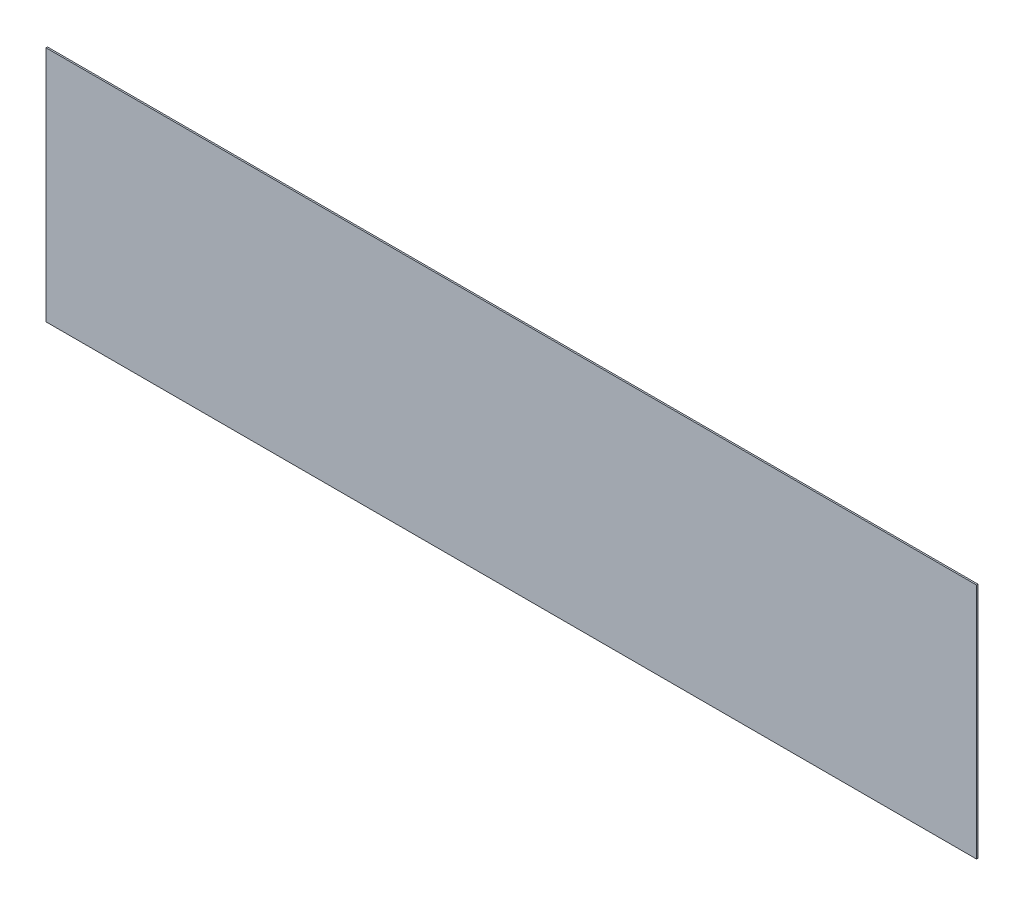
ISO-10303-21;
HEADER;
FILE_DESCRIPTION(('STEP AP214'),'2;1');
FILE_NAME('part.step','',(''),(''),'','','');
FILE_SCHEMA(('AUTOMOTIVE_DESIGN { 1 0 10303 214 1 1 1 1 }'));
ENDSEC;
DATA;
#1=APPLICATION_CONTEXT('core data for automotive mechanical design processes');
#2=APPLICATION_PROTOCOL_DEFINITION('international standard','automotive_design',2000,#1);
#3=PRODUCT_CONTEXT('',#1,'mechanical');
#4=PRODUCT('Part','Part','',(#3));
#5=PRODUCT_RELATED_PRODUCT_CATEGORY('part','',(#4));
#6=PRODUCT_DEFINITION_FORMATION('','',#4);
#7=PRODUCT_DEFINITION_CONTEXT('part definition',#1,'design');
#8=PRODUCT_DEFINITION('design','',#6,#7);
#9=PRODUCT_DEFINITION_SHAPE('','',#8);
#10=(LENGTH_UNIT() NAMED_UNIT(*) SI_UNIT(.MILLI.,.METRE.));
#11=(NAMED_UNIT(*) PLANE_ANGLE_UNIT() SI_UNIT($,.RADIAN.));
#12=(NAMED_UNIT(*) SI_UNIT($,.STERADIAN.) SOLID_ANGLE_UNIT());
#13=UNCERTAINTY_MEASURE_WITH_UNIT(LENGTH_MEASURE(1.E-05),#10,'distance_accuracy_value','');
#14=(GEOMETRIC_REPRESENTATION_CONTEXT(3) GLOBAL_UNCERTAINTY_ASSIGNED_CONTEXT((#13)) GLOBAL_UNIT_ASSIGNED_CONTEXT((#10,
#11,#12)) REPRESENTATION_CONTEXT('',''));
#15=CARTESIAN_POINT('',(0.,0.,0.));
#16=DIRECTION('',(0.,0.,1.));
#17=DIRECTION('',(1.,0.,0.));
#18=AXIS2_PLACEMENT_3D('',#15,#16,#17);
#19=CARTESIAN_POINT('',(0.,0.,0.511));
#20=DIRECTION('',(1.,0.,0.));
#21=DIRECTION('',(0.,0.,-1.));
#22=AXIS2_PLACEMENT_3D('',#19,#20,#21);
#23=PLANE('',#22);
#24=DIRECTION('',(0.,-1.,0.));
#25=VECTOR('',#24,1.);
#26=CARTESIAN_POINT('',(0.,0.,0.));
#27=LINE('',#26,#25);
#28=CARTESIAN_POINT('',(0.,82.,0.));
#29=VERTEX_POINT('',#28);
#30=CARTESIAN_POINT('',(0.,0.,0.));
#31=VERTEX_POINT('',#30);
#32=EDGE_CURVE('E95',#29,#31,#27,.T.);
#33=ORIENTED_EDGE('',*,*,#32,.T.);
#34=DIRECTION('',(0.,0.,-1.));
#35=VECTOR('',#34,1.);
#36=CARTESIAN_POINT('',(0.,0.,0.511));
#37=LINE('',#36,#35);
#38=CARTESIAN_POINT('',(0.,0.,0.511));
#39=VERTEX_POINT('',#38);
#40=EDGE_CURVE('E11',#39,#31,#37,.T.);
#41=ORIENTED_EDGE('',*,*,#40,.F.);
#42=DIRECTION('',(0.,-1.,0.));
#43=VECTOR('',#42,1.);
#44=CARTESIAN_POINT('',(0.,0.,0.511));
#45=LINE('',#44,#43);
#46=CARTESIAN_POINT('',(0.,82.,0.511));
#47=VERTEX_POINT('',#46);
#48=EDGE_CURVE('E83',#47,#39,#45,.T.);
#49=ORIENTED_EDGE('',*,*,#48,.F.);
#50=DIRECTION('',(0.,0.,-1.));
#51=VECTOR('',#50,1.);
#52=CARTESIAN_POINT('',(0.,82.,0.511));
#53=LINE('',#52,#51);
#54=EDGE_CURVE('E91',#47,#29,#53,.T.);
#55=ORIENTED_EDGE('',*,*,#54,.T.);
#56=EDGE_LOOP('',(#33,#41,#49,#55));
#57=FACE_BOUND('',#56,.T.);
#58=ADVANCED_FACE('F32',(#57),#23,.F.);
#59=CARTESIAN_POINT('',(0.,0.,0.511));
#60=DIRECTION('',(0.,1.,0.));
#61=DIRECTION('',(0.,0.,1.));
#62=AXIS2_PLACEMENT_3D('',#59,#60,#61);
#63=PLANE('',#62);
#64=DIRECTION('',(1.,0.,0.));
#65=VECTOR('',#64,1.);
#66=CARTESIAN_POINT('',(0.,0.,0.));
#67=LINE('',#66,#65);
#68=CARTESIAN_POINT('',(321.5,0.,0.));
#69=VERTEX_POINT('',#68);
#70=EDGE_CURVE('E87',#31,#69,#67,.T.);
#71=ORIENTED_EDGE('',*,*,#70,.T.);
#72=DIRECTION('',(0.,0.,-1.));
#73=VECTOR('',#72,1.);
#74=CARTESIAN_POINT('',(321.5,0.,0.511));
#75=LINE('',#74,#73);
#76=CARTESIAN_POINT('',(321.5,0.,0.511));
#77=VERTEX_POINT('',#76);
#78=EDGE_CURVE('E40',#77,#69,#75,.T.);
#79=ORIENTED_EDGE('',*,*,#78,.F.);
#80=DIRECTION('',(1.,0.,0.));
#81=VECTOR('',#80,1.);
#82=CARTESIAN_POINT('',(0.,0.,0.511));
#83=LINE('',#82,#81);
#84=EDGE_CURVE('E78',#39,#77,#83,.T.);
#85=ORIENTED_EDGE('',*,*,#84,.F.);
#86=ORIENTED_EDGE('',*,*,#40,.T.);
#87=EDGE_LOOP('',(#71,#79,#85,#86));
#88=FACE_BOUND('',#87,.T.);
#89=ADVANCED_FACE('F86',(#88),#63,.F.);
#90=CARTESIAN_POINT('',(321.5,0.,0.511));
#91=DIRECTION('',(-1.,0.,0.));
#92=DIRECTION('',(0.,0.,1.));
#93=AXIS2_PLACEMENT_3D('',#90,#91,#92);
#94=PLANE('',#93);
#95=DIRECTION('',(0.,1.,0.));
#96=VECTOR('',#95,1.);
#97=CARTESIAN_POINT('',(321.5,0.,0.));
#98=LINE('',#97,#96);
#99=CARTESIAN_POINT('',(321.5,82.,0.));
#100=VERTEX_POINT('',#99);
#101=EDGE_CURVE('E65',#69,#100,#98,.T.);
#102=ORIENTED_EDGE('',*,*,#101,.T.);
#103=DIRECTION('',(0.,0.,-1.));
#104=VECTOR('',#103,1.);
#105=CARTESIAN_POINT('',(321.5,82.,0.511));
#106=LINE('',#105,#104);
#107=CARTESIAN_POINT('',(321.5,82.,0.511));
#108=VERTEX_POINT('',#107);
#109=EDGE_CURVE('E88',#108,#100,#106,.T.);
#110=ORIENTED_EDGE('',*,*,#109,.F.);
#111=DIRECTION('',(0.,1.,0.));
#112=VECTOR('',#111,1.);
#113=CARTESIAN_POINT('',(321.5,0.,0.511));
#114=LINE('',#113,#112);
#115=EDGE_CURVE('E81',#77,#108,#114,.T.);
#116=ORIENTED_EDGE('',*,*,#115,.F.);
#117=ORIENTED_EDGE('',*,*,#78,.T.);
#118=EDGE_LOOP('',(#102,#110,#116,#117));
#119=FACE_BOUND('',#118,.T.);
#120=ADVANCED_FACE('F89',(#119),#94,.F.);
#121=CARTESIAN_POINT('',(0.,82.,0.511));
#122=DIRECTION('',(0.,-1.,0.));
#123=DIRECTION('',(0.,0.,-1.));
#124=AXIS2_PLACEMENT_3D('',#121,#122,#123);
#125=PLANE('',#124);
#126=DIRECTION('',(-1.,0.,0.));
#127=VECTOR('',#126,1.);
#128=CARTESIAN_POINT('',(0.,82.,0.));
#129=LINE('',#128,#127);
#130=EDGE_CURVE('E71',#100,#29,#129,.T.);
#131=ORIENTED_EDGE('',*,*,#130,.T.);
#132=ORIENTED_EDGE('',*,*,#54,.F.);
#133=DIRECTION('',(-1.,0.,0.));
#134=VECTOR('',#133,1.);
#135=CARTESIAN_POINT('',(0.,82.,0.511));
#136=LINE('',#135,#134);
#137=EDGE_CURVE('E48',#108,#47,#136,.T.);
#138=ORIENTED_EDGE('',*,*,#137,.F.);
#139=ORIENTED_EDGE('',*,*,#109,.T.);
#140=EDGE_LOOP('',(#131,#132,#138,#139));
#141=FACE_BOUND('',#140,.T.);
#142=ADVANCED_FACE('F102',(#141),#125,.F.);
#143=CARTESIAN_POINT('',(0.,82.,0.511));
#144=DIRECTION('',(0.,0.,-1.));
#145=DIRECTION('',(-1.,0.,0.));
#146=AXIS2_PLACEMENT_3D('',#143,#144,#145);
#147=PLANE('',#146);
#148=ORIENTED_EDGE('',*,*,#48,.T.);
#149=ORIENTED_EDGE('',*,*,#84,.T.);
#150=ORIENTED_EDGE('',*,*,#115,.T.);
#151=ORIENTED_EDGE('',*,*,#137,.T.);
#152=EDGE_LOOP('',(#148,#149,#150,#151));
#153=FACE_BOUND('',#152,.T.);
#154=ADVANCED_FACE('F79',(#153),#147,.F.);
#155=CARTESIAN_POINT('',(0.,82.,0.));
#156=DIRECTION('',(0.,0.,-1.));
#157=DIRECTION('',(-1.,0.,0.));
#158=AXIS2_PLACEMENT_3D('',#155,#156,#157);
#159=PLANE('',#158);
#160=ORIENTED_EDGE('',*,*,#32,.F.);
#161=ORIENTED_EDGE('',*,*,#130,.F.);
#162=ORIENTED_EDGE('',*,*,#101,.F.);
#163=ORIENTED_EDGE('',*,*,#70,.F.);
#164=EDGE_LOOP('',(#160,#161,#162,#163));
#165=FACE_BOUND('',#164,.T.);
#166=ADVANCED_FACE('F105',(#165),#159,.T.);
#167=CLOSED_SHELL('',(#58,#89,#120,#142,#154,#166));
#168=MANIFOLD_SOLID_BREP('B2',#167);
#169=ADVANCED_BREP_SHAPE_REPRESENTATION('',(#18,#168),#14);
#170=SHAPE_DEFINITION_REPRESENTATION(#9,#169);
ENDSEC;
END-ISO-10303-21;
